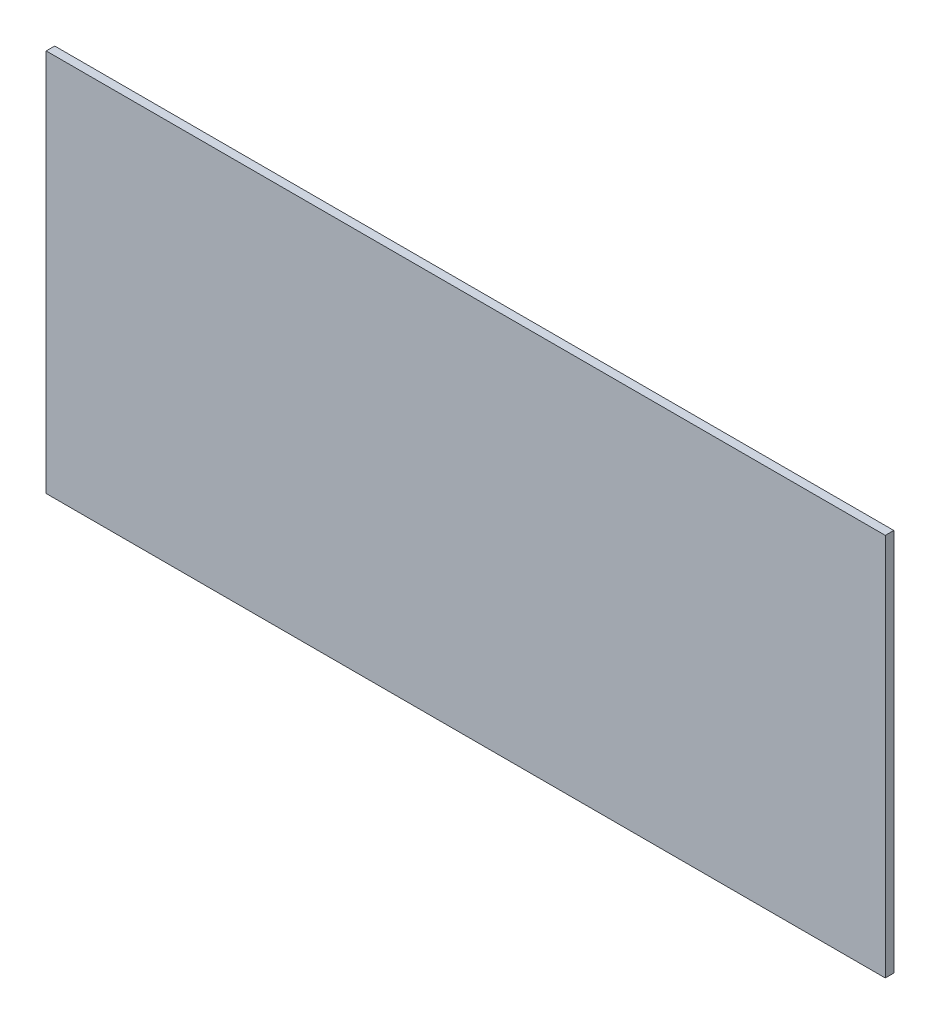
ISO-10303-21;
HEADER;
FILE_DESCRIPTION(('STEP AP214'),'2;1');
FILE_NAME('part.step','',(''),(''),'','','');
FILE_SCHEMA(('AUTOMOTIVE_DESIGN { 1 0 10303 214 1 1 1 1 }'));
ENDSEC;
DATA;
#1=APPLICATION_CONTEXT('core data for automotive mechanical design processes');
#2=APPLICATION_PROTOCOL_DEFINITION('international standard','automotive_design',2000,#1);
#3=PRODUCT_CONTEXT('',#1,'mechanical');
#4=PRODUCT('Part','Part','',(#3));
#5=PRODUCT_RELATED_PRODUCT_CATEGORY('part','',(#4));
#6=PRODUCT_DEFINITION_FORMATION('','',#4);
#7=PRODUCT_DEFINITION_CONTEXT('part definition',#1,'design');
#8=PRODUCT_DEFINITION('design','',#6,#7);
#9=PRODUCT_DEFINITION_SHAPE('','',#8);
#10=(LENGTH_UNIT() NAMED_UNIT(*) SI_UNIT(.MILLI.,.METRE.));
#11=(NAMED_UNIT(*) PLANE_ANGLE_UNIT() SI_UNIT($,.RADIAN.));
#12=(NAMED_UNIT(*) SI_UNIT($,.STERADIAN.) SOLID_ANGLE_UNIT());
#13=UNCERTAINTY_MEASURE_WITH_UNIT(LENGTH_MEASURE(1.E-05),#10,'distance_accuracy_value','');
#14=(GEOMETRIC_REPRESENTATION_CONTEXT(3) GLOBAL_UNCERTAINTY_ASSIGNED_CONTEXT((#13)) GLOBAL_UNIT_ASSIGNED_CONTEXT((#10,
#11,#12)) REPRESENTATION_CONTEXT('',''));
#15=CARTESIAN_POINT('',(0.,0.,0.));
#16=DIRECTION('',(0.,0.,1.));
#17=DIRECTION('',(1.,0.,0.));
#18=AXIS2_PLACEMENT_3D('',#15,#16,#17);
#19=CARTESIAN_POINT('',(-0.045,0.132,0.));
#20=DIRECTION('',(0.,0.,1.));
#21=DIRECTION('',(1.,0.,0.));
#22=AXIS2_PLACEMENT_3D('',#19,#20,#21);
#23=PLANE('',#22);
#24=DIRECTION('',(1.,0.,0.));
#25=VECTOR('',#24,1.);
#26=CARTESIAN_POINT('',(4.88,2.382,0.));
#27=LINE('',#26,#25);
#28=CARTESIAN_POINT('',(4.88,2.382,0.));
#29=VERTEX_POINT('',#28);
#30=CARTESIAN_POINT('',(-4.97,2.382,0.));
#31=VERTEX_POINT('',#30);
#32=EDGE_CURVE('E78',#29,#31,#27,.F.);
#33=ORIENTED_EDGE('',*,*,#32,.F.);
#34=DIRECTION('',(0.,1.,0.));
#35=VECTOR('',#34,1.);
#36=CARTESIAN_POINT('',(4.88,-2.118,0.));
#37=LINE('',#36,#35);
#38=CARTESIAN_POINT('',(4.88,-2.118,0.));
#39=VERTEX_POINT('',#38);
#40=EDGE_CURVE('E54',#39,#29,#37,.T.);
#41=ORIENTED_EDGE('',*,*,#40,.F.);
#42=DIRECTION('',(1.,0.,0.));
#43=VECTOR('',#42,1.);
#44=CARTESIAN_POINT('',(-4.97,-2.118,0.));
#45=LINE('',#44,#43);
#46=CARTESIAN_POINT('',(-4.97,-2.118,0.));
#47=VERTEX_POINT('',#46);
#48=EDGE_CURVE('E56',#47,#39,#45,.T.);
#49=ORIENTED_EDGE('',*,*,#48,.F.);
#50=DIRECTION('',(0.,1.,0.));
#51=VECTOR('',#50,1.);
#52=CARTESIAN_POINT('',(-4.97,2.382,0.));
#53=LINE('',#52,#51);
#54=EDGE_CURVE('E19',#31,#47,#53,.F.);
#55=ORIENTED_EDGE('',*,*,#54,.F.);
#56=EDGE_LOOP('',(#33,#41,#49,#55));
#57=FACE_BOUND('',#56,.T.);
#58=ADVANCED_FACE('F16',(#57),#23,.F.);
#59=CARTESIAN_POINT('',(-4.97,2.382,0.));
#60=DIRECTION('',(-1.,0.,0.));
#61=DIRECTION('',(0.,0.,1.));
#62=AXIS2_PLACEMENT_3D('',#59,#60,#61);
#63=PLANE('',#62);
#64=DIRECTION('',(0.,1.,0.));
#65=VECTOR('',#64,1.);
#66=CARTESIAN_POINT('',(-4.97,0.132,0.1));
#67=LINE('',#66,#65);
#68=CARTESIAN_POINT('',(-4.97,2.382,0.1));
#69=VERTEX_POINT('',#68);
#70=CARTESIAN_POINT('',(-4.97,-2.118,0.1));
#71=VERTEX_POINT('',#70);
#72=EDGE_CURVE('E82',#69,#71,#67,.F.);
#73=ORIENTED_EDGE('',*,*,#72,.F.);
#74=DIRECTION('',(0.,0.,1.));
#75=VECTOR('',#74,1.);
#76=CARTESIAN_POINT('',(-4.97,2.382,0.));
#77=LINE('',#76,#75);
#78=EDGE_CURVE('E67',#31,#69,#77,.T.);
#79=ORIENTED_EDGE('',*,*,#78,.F.);
#80=ORIENTED_EDGE('',*,*,#54,.T.);
#81=DIRECTION('',(0.,0.,-1.));
#82=VECTOR('',#81,1.);
#83=CARTESIAN_POINT('',(-4.97,-2.118,0.));
#84=LINE('',#83,#82);
#85=EDGE_CURVE('E62',#71,#47,#84,.T.);
#86=ORIENTED_EDGE('',*,*,#85,.F.);
#87=EDGE_LOOP('',(#73,#79,#80,#86));
#88=FACE_BOUND('',#87,.T.);
#89=ADVANCED_FACE('F64',(#88),#63,.T.);
#90=CARTESIAN_POINT('',(-4.97,-2.118,0.));
#91=DIRECTION('',(0.,-1.,0.));
#92=DIRECTION('',(0.,0.,-1.));
#93=AXIS2_PLACEMENT_3D('',#90,#91,#92);
#94=PLANE('',#93);
#95=DIRECTION('',(1.,0.,0.));
#96=VECTOR('',#95,1.);
#97=CARTESIAN_POINT('',(-0.045,-2.118,0.1));
#98=LINE('',#97,#96);
#99=CARTESIAN_POINT('',(4.88,-2.118,0.1));
#100=VERTEX_POINT('',#99);
#101=EDGE_CURVE('E71',#71,#100,#98,.T.);
#102=ORIENTED_EDGE('',*,*,#101,.F.);
#103=ORIENTED_EDGE('',*,*,#85,.T.);
#104=ORIENTED_EDGE('',*,*,#48,.T.);
#105=DIRECTION('',(0.,0.,-1.));
#106=VECTOR('',#105,1.);
#107=CARTESIAN_POINT('',(4.88,-2.118,0.));
#108=LINE('',#107,#106);
#109=EDGE_CURVE('E74',#100,#39,#108,.T.);
#110=ORIENTED_EDGE('',*,*,#109,.F.);
#111=EDGE_LOOP('',(#102,#103,#104,#110));
#112=FACE_BOUND('',#111,.T.);
#113=ADVANCED_FACE('F69',(#112),#94,.T.);
#114=CARTESIAN_POINT('',(4.88,-2.118,0.));
#115=DIRECTION('',(1.,0.,0.));
#116=DIRECTION('',(0.,0.,-1.));
#117=AXIS2_PLACEMENT_3D('',#114,#115,#116);
#118=PLANE('',#117);
#119=DIRECTION('',(0.,1.,0.));
#120=VECTOR('',#119,1.);
#121=CARTESIAN_POINT('',(4.88,0.132,0.1));
#122=LINE('',#121,#120);
#123=CARTESIAN_POINT('',(4.88,2.382,0.1));
#124=VERTEX_POINT('',#123);
#125=EDGE_CURVE('E25',#100,#124,#122,.T.);
#126=ORIENTED_EDGE('',*,*,#125,.F.);
#127=ORIENTED_EDGE('',*,*,#109,.T.);
#128=ORIENTED_EDGE('',*,*,#40,.T.);
#129=DIRECTION('',(0.,0.,1.));
#130=VECTOR('',#129,1.);
#131=CARTESIAN_POINT('',(4.88,2.382,0.));
#132=LINE('',#131,#130);
#133=EDGE_CURVE('E34',#124,#29,#132,.F.);
#134=ORIENTED_EDGE('',*,*,#133,.F.);
#135=EDGE_LOOP('',(#126,#127,#128,#134));
#136=FACE_BOUND('',#135,.T.);
#137=ADVANCED_FACE('F88',(#136),#118,.T.);
#138=CARTESIAN_POINT('',(4.88,2.382,0.));
#139=DIRECTION('',(0.,1.,0.));
#140=DIRECTION('',(0.,0.,1.));
#141=AXIS2_PLACEMENT_3D('',#138,#139,#140);
#142=PLANE('',#141);
#143=DIRECTION('',(1.,0.,0.));
#144=VECTOR('',#143,1.);
#145=CARTESIAN_POINT('',(-0.045,2.382,0.1));
#146=LINE('',#145,#144);
#147=EDGE_CURVE('E11',#124,#69,#146,.F.);
#148=ORIENTED_EDGE('',*,*,#147,.F.);
#149=ORIENTED_EDGE('',*,*,#133,.T.);
#150=ORIENTED_EDGE('',*,*,#32,.T.);
#151=ORIENTED_EDGE('',*,*,#78,.T.);
#152=EDGE_LOOP('',(#148,#149,#150,#151));
#153=FACE_BOUND('',#152,.T.);
#154=ADVANCED_FACE('F90',(#153),#142,.T.);
#155=CARTESIAN_POINT('',(-0.045,0.132,0.1));
#156=DIRECTION('',(0.,0.,1.));
#157=DIRECTION('',(1.,0.,0.));
#158=AXIS2_PLACEMENT_3D('',#155,#156,#157);
#159=PLANE('',#158);
#160=ORIENTED_EDGE('',*,*,#125,.T.);
#161=ORIENTED_EDGE('',*,*,#147,.T.);
#162=ORIENTED_EDGE('',*,*,#72,.T.);
#163=ORIENTED_EDGE('',*,*,#101,.T.);
#164=EDGE_LOOP('',(#160,#161,#162,#163));
#165=FACE_BOUND('',#164,.T.);
#166=ADVANCED_FACE('F87',(#165),#159,.T.);
#167=CLOSED_SHELL('',(#58,#89,#113,#137,#154,#166));
#168=MANIFOLD_SOLID_BREP('B1',#167);
#169=ADVANCED_BREP_SHAPE_REPRESENTATION('',(#18,#168),#14);
#170=SHAPE_DEFINITION_REPRESENTATION(#9,#169);
ENDSEC;
END-ISO-10303-21;
